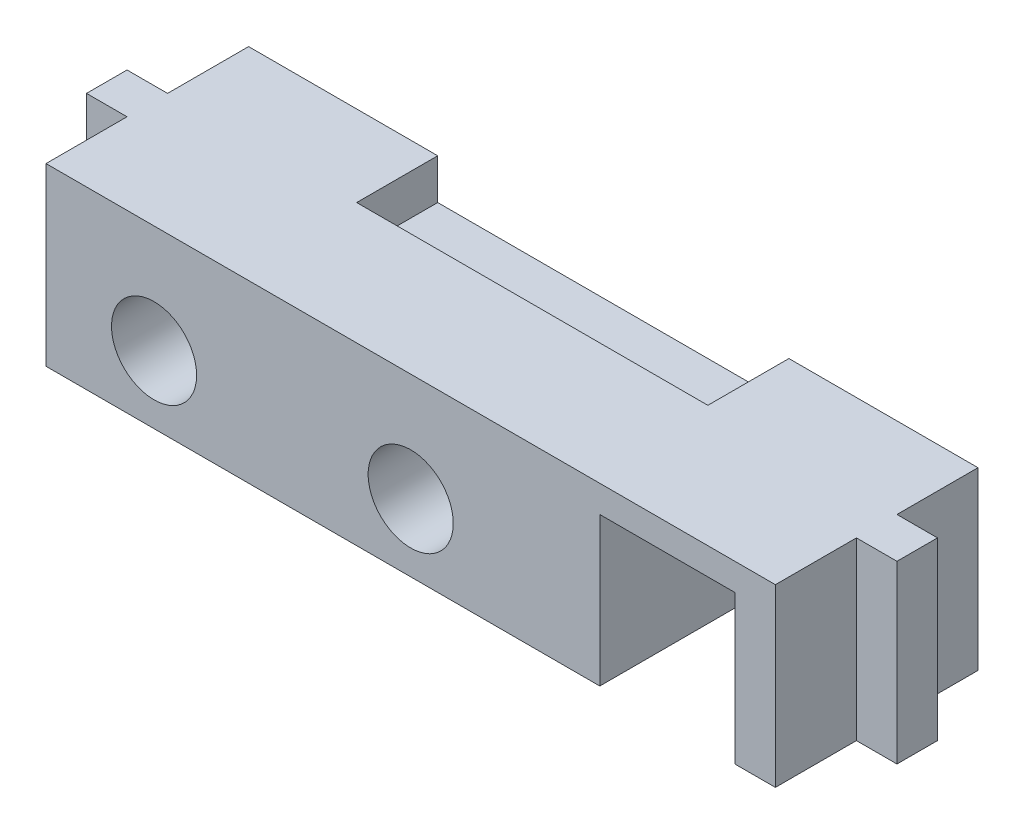
ISO-10303-21;
HEADER;
FILE_DESCRIPTION(('STEP AP214'),'2;1');
FILE_NAME('part.step','',(''),(''),'','','');
FILE_SCHEMA(('AUTOMOTIVE_DESIGN { 1 0 10303 214 1 1 1 1 }'));
ENDSEC;
DATA;
#1=APPLICATION_CONTEXT('core data for automotive mechanical design processes');
#2=APPLICATION_PROTOCOL_DEFINITION('international standard','automotive_design',2000,#1);
#3=PRODUCT_CONTEXT('',#1,'mechanical');
#4=PRODUCT('Part','Part','',(#3));
#5=PRODUCT_RELATED_PRODUCT_CATEGORY('part','',(#4));
#6=PRODUCT_DEFINITION_FORMATION('','',#4);
#7=PRODUCT_DEFINITION_CONTEXT('part definition',#1,'design');
#8=PRODUCT_DEFINITION('design','',#6,#7);
#9=PRODUCT_DEFINITION_SHAPE('','',#8);
#10=(LENGTH_UNIT() NAMED_UNIT(*) SI_UNIT(.MILLI.,.METRE.));
#11=(NAMED_UNIT(*) PLANE_ANGLE_UNIT() SI_UNIT($,.RADIAN.));
#12=(NAMED_UNIT(*) SI_UNIT($,.STERADIAN.) SOLID_ANGLE_UNIT());
#13=UNCERTAINTY_MEASURE_WITH_UNIT(LENGTH_MEASURE(1.E-05),#10,'distance_accuracy_value','');
#14=(GEOMETRIC_REPRESENTATION_CONTEXT(3) GLOBAL_UNCERTAINTY_ASSIGNED_CONTEXT((#13)) GLOBAL_UNIT_ASSIGNED_CONTEXT((#10,
#11,#12)) REPRESENTATION_CONTEXT('',''));
#15=CARTESIAN_POINT('',(0.,0.,0.));
#16=DIRECTION('',(0.,0.,1.));
#17=DIRECTION('',(1.,0.,0.));
#18=AXIS2_PLACEMENT_3D('',#15,#16,#17);
#19=CARTESIAN_POINT('',(0.,6.,7.5));
#20=DIRECTION('',(0.,-1.,0.));
#21=DIRECTION('',(1.,0.,0.));
#22=AXIS2_PLACEMENT_3D('',#19,#20,#21);
#23=PLANE('',#22);
#24=DIRECTION('',(-1.,0.,0.));
#25=VECTOR('',#24,1.);
#26=CARTESIAN_POINT('',(0.,6.,-7.5));
#27=LINE('',#26,#25);
#28=CARTESIAN_POINT('',(20.1000000000001,6.,-7.5));
#29=VERTEX_POINT('',#28);
#30=CARTESIAN_POINT('',(17.8999999999999,6.,-7.5));
#31=VERTEX_POINT('',#30);
#32=EDGE_CURVE('E272',#29,#31,#27,.T.);
#33=ORIENTED_EDGE('',*,*,#32,.F.);
#34=DIRECTION('',(0.,0.,-1.));
#35=VECTOR('',#34,1.);
#36=CARTESIAN_POINT('',(20.1000000000001,6.,-1.6));
#37=LINE('',#36,#35);
#38=CARTESIAN_POINT('',(20.1000000000001,6.,-1.6));
#39=VERTEX_POINT('',#38);
#40=EDGE_CURVE('E263',#39,#29,#37,.T.);
#41=ORIENTED_EDGE('',*,*,#40,.F.);
#42=DIRECTION('',(-1.,0.,0.));
#43=VECTOR('',#42,1.);
#44=CARTESIAN_POINT('',(0.,6.,-1.6));
#45=LINE('',#44,#43);
#46=CARTESIAN_POINT('',(24.,6.,-1.6));
#47=VERTEX_POINT('',#46);
#48=EDGE_CURVE('E249',#47,#39,#45,.T.);
#49=ORIENTED_EDGE('',*,*,#48,.F.);
#50=DIRECTION('',(0.,0.,-1.));
#51=VECTOR('',#50,1.);
#52=CARTESIAN_POINT('',(24.,6.,7.5));
#53=LINE('',#52,#51);
#54=CARTESIAN_POINT('',(24.,6.,7.5));
#55=VERTEX_POINT('',#54);
#56=EDGE_CURVE('E557',#55,#47,#53,.T.);
#57=ORIENTED_EDGE('',*,*,#56,.F.);
#58=DIRECTION('',(-1.,0.,0.));
#59=VECTOR('',#58,1.);
#60=CARTESIAN_POINT('',(0.,6.,7.5));
#61=LINE('',#60,#59);
#62=CARTESIAN_POINT('',(14.,6.,7.5));
#63=VERTEX_POINT('',#62);
#64=EDGE_CURVE('E553',#55,#63,#61,.T.);
#65=ORIENTED_EDGE('',*,*,#64,.T.);
#66=DIRECTION('',(0.,0.,-1.));
#67=VECTOR('',#66,1.);
#68=CARTESIAN_POINT('',(14.,6.,7.5));
#69=LINE('',#68,#67);
#70=CARTESIAN_POINT('',(14.,6.,-1.6));
#71=VERTEX_POINT('',#70);
#72=EDGE_CURVE('E589',#63,#71,#69,.T.);
#73=ORIENTED_EDGE('',*,*,#72,.T.);
#74=DIRECTION('',(-1.,0.,0.));
#75=VECTOR('',#74,1.);
#76=CARTESIAN_POINT('',(0.,6.,-1.6));
#77=LINE('',#76,#75);
#78=CARTESIAN_POINT('',(17.8999999999999,6.,-1.6));
#79=VERTEX_POINT('',#78);
#80=EDGE_CURVE('E288',#79,#71,#77,.T.);
#81=ORIENTED_EDGE('',*,*,#80,.F.);
#82=DIRECTION('',(0.,0.,-1.));
#83=VECTOR('',#82,1.);
#84=CARTESIAN_POINT('',(17.8999999999999,6.,-1.6));
#85=LINE('',#84,#83);
#86=EDGE_CURVE('E295',#79,#31,#85,.T.);
#87=ORIENTED_EDGE('',*,*,#86,.T.);
#88=EDGE_LOOP('',(#33,#41,#49,#57,#65,#73,#81,#87));
#89=FACE_BOUND('',#88,.T.);
#90=ADVANCED_FACE('F41',(#89),#23,.T.);
#91=CARTESIAN_POINT('',(24.,0.,7.5));
#92=DIRECTION('',(-1.,0.,0.));
#93=DIRECTION('',(0.,0.,1.));
#94=AXIS2_PLACEMENT_3D('',#91,#92,#93);
#95=PLANE('',#94);
#96=DIRECTION('',(0.,1.,0.));
#97=VECTOR('',#96,1.);
#98=CARTESIAN_POINT('',(24.,0.,-1.6));
#99=LINE('',#98,#97);
#100=CARTESIAN_POINT('',(24.,3.49428104193127,-1.6));
#101=VERTEX_POINT('',#100);
#102=EDGE_CURVE('E255',#101,#47,#99,.T.);
#103=ORIENTED_EDGE('',*,*,#102,.F.);
#104=DIRECTION('',(0.,0.,-1.));
#105=VECTOR('',#104,1.);
#106=CARTESIAN_POINT('',(24.,3.49428104193127,-1.6));
#107=LINE('',#106,#105);
#108=CARTESIAN_POINT('',(24.,3.49428104193127,-7.5));
#109=VERTEX_POINT('',#108);
#110=EDGE_CURVE('E266',#101,#109,#107,.T.);
#111=ORIENTED_EDGE('',*,*,#110,.T.);
#112=DIRECTION('',(0.,1.,0.));
#113=VECTOR('',#112,1.);
#114=CARTESIAN_POINT('',(24.,0.,-7.5));
#115=LINE('',#114,#113);
#116=CARTESIAN_POINT('',(24.,-5.,-7.5));
#117=VERTEX_POINT('',#116);
#118=EDGE_CURVE('E565',#117,#109,#115,.T.);
#119=ORIENTED_EDGE('',*,*,#118,.F.);
#120=DIRECTION('',(0.,0.,-1.));
#121=VECTOR('',#120,1.);
#122=CARTESIAN_POINT('',(24.,-5.,7.5));
#123=LINE('',#122,#121);
#124=CARTESIAN_POINT('',(24.,-5.,7.5));
#125=VERTEX_POINT('',#124);
#126=EDGE_CURVE('E11',#125,#117,#123,.T.);
#127=ORIENTED_EDGE('',*,*,#126,.F.);
#128=DIRECTION('',(0.,1.,0.));
#129=VECTOR('',#128,1.);
#130=CARTESIAN_POINT('',(24.,0.,7.5));
#131=LINE('',#130,#129);
#132=EDGE_CURVE('E535',#125,#55,#131,.T.);
#133=ORIENTED_EDGE('',*,*,#132,.T.);
#134=ORIENTED_EDGE('',*,*,#56,.T.);
#135=EDGE_LOOP('',(#103,#111,#119,#127,#133,#134));
#136=FACE_BOUND('',#135,.T.);
#137=ADVANCED_FACE('F650',(#136),#95,.T.);
#138=CARTESIAN_POINT('',(14.,0.,7.5));
#139=DIRECTION('',(-1.,0.,0.));
#140=DIRECTION('',(0.,-1.,0.));
#141=AXIS2_PLACEMENT_3D('',#138,#139,#140);
#142=PLANE('',#141);
#143=DIRECTION('',(0.,0.,-1.));
#144=VECTOR('',#143,1.);
#145=CARTESIAN_POINT('',(14.,3.49428104193123,-1.6));
#146=LINE('',#145,#144);
#147=CARTESIAN_POINT('',(14.,3.49428104193123,-1.6));
#148=VERTEX_POINT('',#147);
#149=CARTESIAN_POINT('',(14.,3.49428104193123,-7.5));
#150=VERTEX_POINT('',#149);
#151=EDGE_CURVE('E291',#148,#150,#146,.T.);
#152=ORIENTED_EDGE('',*,*,#151,.F.);
#153=DIRECTION('',(0.,-1.,0.));
#154=VECTOR('',#153,1.);
#155=CARTESIAN_POINT('',(14.,0.,-1.6));
#156=LINE('',#155,#154);
#157=EDGE_CURVE('E285',#71,#148,#156,.T.);
#158=ORIENTED_EDGE('',*,*,#157,.F.);
#159=ORIENTED_EDGE('',*,*,#72,.F.);
#160=DIRECTION('',(0.,1.,0.));
#161=VECTOR('',#160,1.);
#162=CARTESIAN_POINT('',(14.,0.,7.5));
#163=LINE('',#162,#161);
#164=CARTESIAN_POINT('',(14.,-5.,7.5));
#165=VERTEX_POINT('',#164);
#166=EDGE_CURVE('E550',#165,#63,#163,.T.);
#167=ORIENTED_EDGE('',*,*,#166,.F.);
#168=DIRECTION('',(0.,0.,-1.));
#169=VECTOR('',#168,1.);
#170=CARTESIAN_POINT('',(14.,-5.,7.5));
#171=LINE('',#170,#169);
#172=CARTESIAN_POINT('',(14.,-5.,-7.5));
#173=VERTEX_POINT('',#172);
#174=EDGE_CURVE('E593',#165,#173,#171,.T.);
#175=ORIENTED_EDGE('',*,*,#174,.T.);
#176=DIRECTION('',(0.,1.,0.));
#177=VECTOR('',#176,1.);
#178=CARTESIAN_POINT('',(14.,0.,-7.5));
#179=LINE('',#178,#177);
#180=EDGE_CURVE('E581',#173,#150,#179,.T.);
#181=ORIENTED_EDGE('',*,*,#180,.T.);
#182=EDGE_LOOP('',(#152,#158,#159,#167,#175,#181));
#183=FACE_BOUND('',#182,.T.);
#184=ADVANCED_FACE('F665',(#183),#142,.F.);
#185=CARTESIAN_POINT('',(30.,0.,7.5));
#186=DIRECTION('',(-1.,0.,0.));
#187=DIRECTION('',(0.,0.,1.));
#188=AXIS2_PLACEMENT_3D('',#185,#186,#187);
#189=PLANE('',#188);
#190=DIRECTION('',(0.,1.,0.));
#191=VECTOR('',#190,1.);
#192=CARTESIAN_POINT('',(30.,-5.,1.5));
#193=LINE('',#192,#191);
#194=CARTESIAN_POINT('',(30.,-5.,1.5));
#195=VERTEX_POINT('',#194);
#196=CARTESIAN_POINT('',(30.,8.,1.5));
#197=VERTEX_POINT('',#196);
#198=EDGE_CURVE('E338',#195,#197,#193,.T.);
#199=ORIENTED_EDGE('',*,*,#198,.F.);
#200=DIRECTION('',(0.,0.,-1.));
#201=VECTOR('',#200,1.);
#202=CARTESIAN_POINT('',(30.,-5.,7.5));
#203=LINE('',#202,#201);
#204=CARTESIAN_POINT('',(30.,-5.,-1.5));
#205=VERTEX_POINT('',#204);
#206=EDGE_CURVE('E50',#195,#205,#203,.T.);
#207=ORIENTED_EDGE('',*,*,#206,.T.);
#208=DIRECTION('',(0.,1.,0.));
#209=VECTOR('',#208,1.);
#210=CARTESIAN_POINT('',(30.,0.,-1.5));
#211=LINE('',#210,#209);
#212=CARTESIAN_POINT('',(30.,8.,-1.5));
#213=VERTEX_POINT('',#212);
#214=EDGE_CURVE('E413',#205,#213,#211,.T.);
#215=ORIENTED_EDGE('',*,*,#214,.T.);
#216=DIRECTION('',(0.,0.,-1.));
#217=VECTOR('',#216,1.);
#218=CARTESIAN_POINT('',(30.,8.,7.5));
#219=LINE('',#218,#217);
#220=EDGE_CURVE('E603',#197,#213,#219,.T.);
#221=ORIENTED_EDGE('',*,*,#220,.F.);
#222=EDGE_LOOP('',(#199,#207,#215,#221));
#223=FACE_BOUND('',#222,.T.);
#224=ADVANCED_FACE('F610',(#223),#189,.F.);
#225=CARTESIAN_POINT('',(0.,-5.,7.5));
#226=DIRECTION('',(0.,1.,0.));
#227=DIRECTION('',(0.,0.,1.));
#228=AXIS2_PLACEMENT_3D('',#225,#226,#227);
#229=PLANE('',#228);
#230=DIRECTION('',(0.,0.,-1.));
#231=VECTOR('',#230,1.);
#232=CARTESIAN_POINT('',(-10.,-5.,2.));
#233=LINE('',#232,#231);
#234=CARTESIAN_POINT('',(-10.,-5.,2.));
#235=VERTEX_POINT('',#234);
#236=CARTESIAN_POINT('',(-10.,-5.,-2.));
#237=VERTEX_POINT('',#236);
#238=EDGE_CURVE('E412',#235,#237,#233,.T.);
#239=ORIENTED_EDGE('',*,*,#238,.F.);
#240=DIRECTION('',(-1.,0.,0.));
#241=VECTOR('',#240,1.);
#242=CARTESIAN_POINT('',(-10.,-5.,2.));
#243=LINE('',#242,#241);
#244=CARTESIAN_POINT('',(-6.,-5.,2.));
#245=VERTEX_POINT('',#244);
#246=EDGE_CURVE('E442',#245,#235,#243,.T.);
#247=ORIENTED_EDGE('',*,*,#246,.F.);
#248=DIRECTION('',(0.,0.,1.));
#249=VECTOR('',#248,1.);
#250=CARTESIAN_POINT('',(-6.,-5.,2.));
#251=LINE('',#250,#249);
#252=CARTESIAN_POINT('',(-6.,-5.,-2.));
#253=VERTEX_POINT('',#252);
#254=EDGE_CURVE('E459',#253,#245,#251,.T.);
#255=ORIENTED_EDGE('',*,*,#254,.F.);
#256=DIRECTION('',(1.,0.,0.));
#257=VECTOR('',#256,1.);
#258=CARTESIAN_POINT('',(-10.,-5.,-2.));
#259=LINE('',#258,#257);
#260=EDGE_CURVE('E455',#237,#253,#259,.T.);
#261=ORIENTED_EDGE('',*,*,#260,.F.);
#262=EDGE_LOOP('',(#239,#247,#255,#261));
#263=FACE_BOUND('',#262,.T.);
#264=DIRECTION('',(0.,0.,-1.));
#265=VECTOR('',#264,1.);
#266=CARTESIAN_POINT('',(6.,-5.,2.));
#267=LINE('',#266,#265);
#268=CARTESIAN_POINT('',(6.,-5.,2.));
#269=VERTEX_POINT('',#268);
#270=CARTESIAN_POINT('',(6.,-5.,-2.));
#271=VERTEX_POINT('',#270);
#272=EDGE_CURVE('E481',#269,#271,#267,.T.);
#273=ORIENTED_EDGE('',*,*,#272,.F.);
#274=DIRECTION('',(-1.,0.,0.));
#275=VECTOR('',#274,1.);
#276=CARTESIAN_POINT('',(10.,-5.,2.));
#277=LINE('',#276,#275);
#278=CARTESIAN_POINT('',(10.,-5.,2.));
#279=VERTEX_POINT('',#278);
#280=EDGE_CURVE('E487',#279,#269,#277,.T.);
#281=ORIENTED_EDGE('',*,*,#280,.F.);
#282=DIRECTION('',(0.,0.,1.));
#283=VECTOR('',#282,1.);
#284=CARTESIAN_POINT('',(10.,-5.,2.));
#285=LINE('',#284,#283);
#286=CARTESIAN_POINT('',(10.,-5.,-2.));
#287=VERTEX_POINT('',#286);
#288=EDGE_CURVE('E504',#287,#279,#285,.T.);
#289=ORIENTED_EDGE('',*,*,#288,.F.);
#290=DIRECTION('',(1.,0.,0.));
#291=VECTOR('',#290,1.);
#292=CARTESIAN_POINT('',(10.,-5.,-2.));
#293=LINE('',#292,#291);
#294=EDGE_CURVE('E500',#271,#287,#293,.T.);
#295=ORIENTED_EDGE('',*,*,#294,.F.);
#296=EDGE_LOOP('',(#273,#281,#289,#295));
#297=FACE_BOUND('',#296,.T.);
#298=DIRECTION('',(1.,0.,0.));
#299=VECTOR('',#298,1.);
#300=CARTESIAN_POINT('',(0.,-5.,7.5));
#301=LINE('',#300,#299);
#302=CARTESIAN_POINT('',(-27.,-5.,7.5));
#303=VERTEX_POINT('',#302);
#304=EDGE_CURVE('E547',#303,#165,#301,.T.);
#305=ORIENTED_EDGE('',*,*,#304,.F.);
#306=DIRECTION('',(0.,0.,1.));
#307=VECTOR('',#306,1.);
#308=CARTESIAN_POINT('',(-27.,-5.,1.5));
#309=LINE('',#308,#307);
#310=CARTESIAN_POINT('',(-27.,-5.,1.5));
#311=VERTEX_POINT('',#310);
#312=EDGE_CURVE('E65',#311,#303,#309,.T.);
#313=ORIENTED_EDGE('',*,*,#312,.F.);
#314=DIRECTION('',(1.,0.,0.));
#315=VECTOR('',#314,1.);
#316=CARTESIAN_POINT('',(-27.,-5.,1.5));
#317=LINE('',#316,#315);
#318=CARTESIAN_POINT('',(-30.,-5.,1.5));
#319=VERTEX_POINT('',#318);
#320=EDGE_CURVE('E364',#319,#311,#317,.T.);
#321=ORIENTED_EDGE('',*,*,#320,.F.);
#322=DIRECTION('',(0.,0.,-1.));
#323=VECTOR('',#322,1.);
#324=CARTESIAN_POINT('',(-30.,-5.,7.5));
#325=LINE('',#324,#323);
#326=CARTESIAN_POINT('',(-30.,-5.,-1.5));
#327=VERTEX_POINT('',#326);
#328=EDGE_CURVE('E597',#319,#327,#325,.T.);
#329=ORIENTED_EDGE('',*,*,#328,.T.);
#330=DIRECTION('',(1.,0.,0.));
#331=VECTOR('',#330,1.);
#332=CARTESIAN_POINT('',(0.,-5.,-1.5));
#333=LINE('',#332,#331);
#334=CARTESIAN_POINT('',(-27.,-5.,-1.5));
#335=VERTEX_POINT('',#334);
#336=EDGE_CURVE('E389',#327,#335,#333,.T.);
#337=ORIENTED_EDGE('',*,*,#336,.T.);
#338=DIRECTION('',(0.,0.,-1.));
#339=VECTOR('',#338,1.);
#340=CARTESIAN_POINT('',(-27.,-5.,-1.5));
#341=LINE('',#340,#339);
#342=CARTESIAN_POINT('',(-27.,-5.,-7.5));
#343=VERTEX_POINT('',#342);
#344=EDGE_CURVE('E408',#335,#343,#341,.T.);
#345=ORIENTED_EDGE('',*,*,#344,.T.);
#346=DIRECTION('',(1.,0.,0.));
#347=VECTOR('',#346,1.);
#348=CARTESIAN_POINT('',(0.,-5.,-7.5));
#349=LINE('',#348,#347);
#350=EDGE_CURVE('E578',#343,#173,#349,.T.);
#351=ORIENTED_EDGE('',*,*,#350,.T.);
#352=ORIENTED_EDGE('',*,*,#174,.F.);
#353=EDGE_LOOP('',(#305,#313,#321,#329,#337,#345,#351,#352));
#354=FACE_BOUND('',#353,.T.);
#355=ADVANCED_FACE('F672',(#263,#297,#354),#229,.F.);
#356=CARTESIAN_POINT('',(0.,-5.,7.5));
#357=DIRECTION('',(0.,1.,0.));
#358=DIRECTION('',(0.,0.,1.));
#359=AXIS2_PLACEMENT_3D('',#356,#357,#358);
#360=PLANE('',#359);
#361=DIRECTION('',(1.,0.,0.));
#362=VECTOR('',#361,1.);
#363=CARTESIAN_POINT('',(27.,-5.,1.5));
#364=LINE('',#363,#362);
#365=CARTESIAN_POINT('',(27.,-5.,1.5));
#366=VERTEX_POINT('',#365);
#367=EDGE_CURVE('E350',#366,#195,#364,.T.);
#368=ORIENTED_EDGE('',*,*,#367,.F.);
#369=DIRECTION('',(0.,0.,1.));
#370=VECTOR('',#369,1.);
#371=CARTESIAN_POINT('',(27.,-5.,1.5));
#372=LINE('',#371,#370);
#373=CARTESIAN_POINT('',(27.,-5.,7.5));
#374=VERTEX_POINT('',#373);
#375=EDGE_CURVE('E357',#366,#374,#372,.T.);
#376=ORIENTED_EDGE('',*,*,#375,.T.);
#377=DIRECTION('',(1.,0.,0.));
#378=VECTOR('',#377,1.);
#379=CARTESIAN_POINT('',(0.,-5.,7.5));
#380=LINE('',#379,#378);
#381=EDGE_CURVE('E539',#125,#374,#380,.T.);
#382=ORIENTED_EDGE('',*,*,#381,.F.);
#383=ORIENTED_EDGE('',*,*,#126,.T.);
#384=DIRECTION('',(1.,0.,0.));
#385=VECTOR('',#384,1.);
#386=CARTESIAN_POINT('',(0.,-5.,-7.5));
#387=LINE('',#386,#385);
#388=CARTESIAN_POINT('',(27.,-5.,-7.5));
#389=VERTEX_POINT('',#388);
#390=EDGE_CURVE('E569',#117,#389,#387,.T.);
#391=ORIENTED_EDGE('',*,*,#390,.T.);
#392=DIRECTION('',(0.,0.,-1.));
#393=VECTOR('',#392,1.);
#394=CARTESIAN_POINT('',(27.,-5.,-1.5));
#395=LINE('',#394,#393);
#396=CARTESIAN_POINT('',(27.,-5.,-1.5));
#397=VERTEX_POINT('',#396);
#398=EDGE_CURVE('E428',#397,#389,#395,.T.);
#399=ORIENTED_EDGE('',*,*,#398,.F.);
#400=DIRECTION('',(1.,0.,0.));
#401=VECTOR('',#400,1.);
#402=CARTESIAN_POINT('',(0.,-5.,-1.5));
#403=LINE('',#402,#401);
#404=EDGE_CURVE('E424',#397,#205,#403,.T.);
#405=ORIENTED_EDGE('',*,*,#404,.T.);
#406=ORIENTED_EDGE('',*,*,#206,.F.);
#407=EDGE_LOOP('',(#368,#376,#382,#383,#391,#399,#405,#406));
#408=FACE_BOUND('',#407,.T.);
#409=ADVANCED_FACE('F620',(#408),#360,.F.);
#410=CARTESIAN_POINT('',(0.,8.,7.5));
#411=DIRECTION('',(0.,1.,0.));
#412=DIRECTION('',(0.,0.,1.));
#413=AXIS2_PLACEMENT_3D('',#410,#411,#412);
#414=PLANE('',#413);
#415=DIRECTION('',(0.,0.,-1.));
#416=VECTOR('',#415,1.);
#417=CARTESIAN_POINT('',(13.,8.00000000000001,-1.5));
#418=LINE('',#417,#416);
#419=CARTESIAN_POINT('',(13.,8.00000000000001,-1.5));
#420=VERTEX_POINT('',#419);
#421=CARTESIAN_POINT('',(13.,8.00000000000001,-7.5));
#422=VERTEX_POINT('',#421);
#423=EDGE_CURVE('E329',#420,#422,#418,.T.);
#424=ORIENTED_EDGE('',*,*,#423,.F.);
#425=DIRECTION('',(1.,0.,0.));
#426=VECTOR('',#425,1.);
#427=CARTESIAN_POINT('',(13.,8.00000000000001,-1.5));
#428=LINE('',#427,#426);
#429=CARTESIAN_POINT('',(-13.,8.00000000000001,-1.5));
#430=VERTEX_POINT('',#429);
#431=EDGE_CURVE('E309',#430,#420,#428,.T.);
#432=ORIENTED_EDGE('',*,*,#431,.F.);
#433=DIRECTION('',(0.,0.,-1.));
#434=VECTOR('',#433,1.);
#435=CARTESIAN_POINT('',(-13.,8.00000000000001,-1.5));
#436=LINE('',#435,#434);
#437=CARTESIAN_POINT('',(-13.,8.00000000000001,-7.5));
#438=VERTEX_POINT('',#437);
#439=EDGE_CURVE('E332',#430,#438,#436,.T.);
#440=ORIENTED_EDGE('',*,*,#439,.T.);
#441=DIRECTION('',(1.,0.,0.));
#442=VECTOR('',#441,1.);
#443=CARTESIAN_POINT('',(0.,8.,-7.5));
#444=LINE('',#443,#442);
#445=CARTESIAN_POINT('',(-27.,8.,-7.5));
#446=VERTEX_POINT('',#445);
#447=EDGE_CURVE('E574',#446,#438,#444,.T.);
#448=ORIENTED_EDGE('',*,*,#447,.F.);
#449=DIRECTION('',(0.,0.,-1.));
#450=VECTOR('',#449,1.);
#451=CARTESIAN_POINT('',(-27.,8.,-1.5));
#452=LINE('',#451,#450);
#453=CARTESIAN_POINT('',(-27.,8.,-1.5));
#454=VERTEX_POINT('',#453);
#455=EDGE_CURVE('E401',#454,#446,#452,.T.);
#456=ORIENTED_EDGE('',*,*,#455,.F.);
#457=DIRECTION('',(-1.,0.,0.));
#458=VECTOR('',#457,1.);
#459=CARTESIAN_POINT('',(0.,8.,-1.5));
#460=LINE('',#459,#458);
#461=CARTESIAN_POINT('',(-30.,8.,-1.5));
#462=VERTEX_POINT('',#461);
#463=EDGE_CURVE('E397',#454,#462,#460,.T.);
#464=ORIENTED_EDGE('',*,*,#463,.T.);
#465=DIRECTION('',(0.,0.,-1.));
#466=VECTOR('',#465,1.);
#467=CARTESIAN_POINT('',(-30.,8.,7.5));
#468=LINE('',#467,#466);
#469=CARTESIAN_POINT('',(-30.,8.,1.5));
#470=VERTEX_POINT('',#469);
#471=EDGE_CURVE('E600',#470,#462,#468,.T.);
#472=ORIENTED_EDGE('',*,*,#471,.F.);
#473=DIRECTION('',(-1.,0.,0.));
#474=VECTOR('',#473,1.);
#475=CARTESIAN_POINT('',(-30.,8.,1.5));
#476=LINE('',#475,#474);
#477=CARTESIAN_POINT('',(-27.,8.,1.5));
#478=VERTEX_POINT('',#477);
#479=EDGE_CURVE('E372',#478,#470,#476,.T.);
#480=ORIENTED_EDGE('',*,*,#479,.F.);
#481=DIRECTION('',(0.,0.,1.));
#482=VECTOR('',#481,1.);
#483=CARTESIAN_POINT('',(-27.,8.,1.5));
#484=LINE('',#483,#482);
#485=CARTESIAN_POINT('',(-27.,8.,7.5));
#486=VERTEX_POINT('',#485);
#487=EDGE_CURVE('E356',#478,#486,#484,.T.);
#488=ORIENTED_EDGE('',*,*,#487,.T.);
#489=DIRECTION('',(1.,0.,0.));
#490=VECTOR('',#489,1.);
#491=CARTESIAN_POINT('',(0.,8.,7.5));
#492=LINE('',#491,#490);
#493=CARTESIAN_POINT('',(27.,8.,7.5));
#494=VERTEX_POINT('',#493);
#495=EDGE_CURVE('E543',#486,#494,#492,.T.);
#496=ORIENTED_EDGE('',*,*,#495,.T.);
#497=DIRECTION('',(0.,0.,1.));
#498=VECTOR('',#497,1.);
#499=CARTESIAN_POINT('',(27.,8.,1.5));
#500=LINE('',#499,#498);
#501=CARTESIAN_POINT('',(27.,8.,1.5));
#502=VERTEX_POINT('',#501);
#503=EDGE_CURVE('E353',#502,#494,#500,.T.);
#504=ORIENTED_EDGE('',*,*,#503,.F.);
#505=DIRECTION('',(-1.,0.,0.));
#506=VECTOR('',#505,1.);
#507=CARTESIAN_POINT('',(30.,8.,1.5));
#508=LINE('',#507,#506);
#509=EDGE_CURVE('E341',#197,#502,#508,.T.);
#510=ORIENTED_EDGE('',*,*,#509,.F.);
#511=ORIENTED_EDGE('',*,*,#220,.T.);
#512=DIRECTION('',(-1.,0.,0.));
#513=VECTOR('',#512,1.);
#514=CARTESIAN_POINT('',(0.,8.,-1.5));
#515=LINE('',#514,#513);
#516=CARTESIAN_POINT('',(27.,8.,-1.5));
#517=VERTEX_POINT('',#516);
#518=EDGE_CURVE('E417',#213,#517,#515,.T.);
#519=ORIENTED_EDGE('',*,*,#518,.T.);
#520=DIRECTION('',(0.,0.,-1.));
#521=VECTOR('',#520,1.);
#522=CARTESIAN_POINT('',(27.,8.,-1.5));
#523=LINE('',#522,#521);
#524=CARTESIAN_POINT('',(27.,8.,-7.5));
#525=VERTEX_POINT('',#524);
#526=EDGE_CURVE('E405',#517,#525,#523,.T.);
#527=ORIENTED_EDGE('',*,*,#526,.T.);
#528=EDGE_CURVE('E573',#422,#525,#444,.T.);
#529=ORIENTED_EDGE('',*,*,#528,.F.);
#530=EDGE_LOOP('',(#424,#432,#440,#448,#456,#464,#472,#480,#488,#496,#504,#510,#511,#519,#527,#529));
#531=FACE_BOUND('',#530,.T.);
#532=ADVANCED_FACE('F634',(#531),#414,.T.);
#533=CARTESIAN_POINT('',(0.,0.,-7.5));
#534=DIRECTION('',(0.,0.,1.));
#535=DIRECTION('',(1.,0.,0.));
#536=AXIS2_PLACEMENT_3D('',#533,#534,#535);
#537=PLANE('',#536);
#538=CARTESIAN_POINT('',(19.,0.,-7.5));
#539=DIRECTION('',(0.,0.,-1.));
#540=DIRECTION('',(-1.,0.,0.));
#541=AXIS2_PLACEMENT_3D('',#538,#539,#540);
#542=CIRCLE('',#541,6.1);
#543=EDGE_CURVE('E268',#29,#109,#542,.T.);
#544=ORIENTED_EDGE('',*,*,#543,.F.);
#545=ORIENTED_EDGE('',*,*,#32,.T.);
#546=CARTESIAN_POINT('',(19.,0.,-7.5));
#547=DIRECTION('',(0.,0.,-1.));
#548=DIRECTION('',(-1.,0.,0.));
#549=AXIS2_PLACEMENT_3D('',#546,#547,#548);
#550=CIRCLE('',#549,6.1);
#551=EDGE_CURVE('E277',#150,#31,#550,.T.);
#552=ORIENTED_EDGE('',*,*,#551,.F.);
#553=ORIENTED_EDGE('',*,*,#180,.F.);
#554=ORIENTED_EDGE('',*,*,#350,.F.);
#555=DIRECTION('',(0.,1.,0.));
#556=VECTOR('',#555,1.);
#557=CARTESIAN_POINT('',(-27.,0.,-7.5));
#558=LINE('',#557,#556);
#559=EDGE_CURVE('E390',#343,#446,#558,.T.);
#560=ORIENTED_EDGE('',*,*,#559,.T.);
#561=ORIENTED_EDGE('',*,*,#447,.T.);
#562=DIRECTION('',(0.,1.,0.));
#563=VECTOR('',#562,1.);
#564=CARTESIAN_POINT('',(-13.,5.00000000000001,-7.5));
#565=LINE('',#564,#563);
#566=CARTESIAN_POINT('',(-13.,5.00000000000001,-7.5));
#567=VERTEX_POINT('',#566);
#568=EDGE_CURVE('E319',#567,#438,#565,.T.);
#569=ORIENTED_EDGE('',*,*,#568,.F.);
#570=DIRECTION('',(-1.,0.,0.));
#571=VECTOR('',#570,1.);
#572=CARTESIAN_POINT('',(13.,5.00000000000001,-7.5));
#573=LINE('',#572,#571);
#574=CARTESIAN_POINT('',(13.,5.00000000000001,-7.5));
#575=VERTEX_POINT('',#574);
#576=EDGE_CURVE('E57',#575,#567,#573,.T.);
#577=ORIENTED_EDGE('',*,*,#576,.F.);
#578=DIRECTION('',(0.,-1.,0.));
#579=VECTOR('',#578,1.);
#580=CARTESIAN_POINT('',(13.,5.00000000000001,-7.5));
#581=LINE('',#580,#579);
#582=EDGE_CURVE('E305',#422,#575,#581,.T.);
#583=ORIENTED_EDGE('',*,*,#582,.F.);
#584=ORIENTED_EDGE('',*,*,#528,.T.);
#585=DIRECTION('',(0.,-1.,0.));
#586=VECTOR('',#585,1.);
#587=CARTESIAN_POINT('',(27.,0.,-7.5));
#588=LINE('',#587,#586);
#589=EDGE_CURVE('E361',#525,#389,#588,.T.);
#590=ORIENTED_EDGE('',*,*,#589,.T.);
#591=ORIENTED_EDGE('',*,*,#390,.F.);
#592=ORIENTED_EDGE('',*,*,#118,.T.);
#593=EDGE_LOOP('',(#544,#545,#552,#553,#554,#560,#561,#569,#577,#583,#584,#590,#591,#592));
#594=FACE_BOUND('',#593,.T.);
#595=CARTESIAN_POINT('',(0.,0.,-7.5));
#596=DIRECTION('',(0.,0.,1.));
#597=DIRECTION('',(1.,0.,0.));
#598=AXIS2_PLACEMENT_3D('',#595,#596,#597);
#599=CIRCLE('',#598,3.15);
#600=CARTESIAN_POINT('',(3.15,0.,-7.5));
#601=VERTEX_POINT('',#600);
#602=EDGE_CURVE('E526',#601,#601,#599,.T.);
#603=ORIENTED_EDGE('',*,*,#602,.T.);
#604=EDGE_LOOP('',(#603));
#605=FACE_BOUND('',#604,.T.);
#606=CARTESIAN_POINT('',(-19.,0.,-7.5));
#607=DIRECTION('',(0.,0.,1.));
#608=DIRECTION('',(1.,0.,0.));
#609=AXIS2_PLACEMENT_3D('',#606,#607,#608);
#610=CIRCLE('',#609,3.15);
#611=CARTESIAN_POINT('',(-15.85,0.,-7.5));
#612=VERTEX_POINT('',#611);
#613=EDGE_CURVE('E561',#612,#612,#610,.T.);
#614=ORIENTED_EDGE('',*,*,#613,.T.);
#615=EDGE_LOOP('',(#614));
#616=FACE_BOUND('',#615,.T.);
#617=ADVANCED_FACE('F626',(#594,#605,#616),#537,.F.);
#618=CARTESIAN_POINT('',(-30.,0.,7.5));
#619=DIRECTION('',(-1.,0.,0.));
#620=DIRECTION('',(0.,0.,1.));
#621=AXIS2_PLACEMENT_3D('',#618,#619,#620);
#622=PLANE('',#621);
#623=DIRECTION('',(0.,-1.,0.));
#624=VECTOR('',#623,1.);
#625=CARTESIAN_POINT('',(-30.,-5.,1.5));
#626=LINE('',#625,#624);
#627=EDGE_CURVE('E375',#470,#319,#626,.T.);
#628=ORIENTED_EDGE('',*,*,#627,.F.);
#629=ORIENTED_EDGE('',*,*,#471,.T.);
#630=DIRECTION('',(0.,-1.,0.));
#631=VECTOR('',#630,1.);
#632=CARTESIAN_POINT('',(-30.,0.,-1.5));
#633=LINE('',#632,#631);
#634=EDGE_CURVE('E385',#462,#327,#633,.T.);
#635=ORIENTED_EDGE('',*,*,#634,.T.);
#636=ORIENTED_EDGE('',*,*,#328,.F.);
#637=EDGE_LOOP('',(#628,#629,#635,#636));
#638=FACE_BOUND('',#637,.T.);
#639=ADVANCED_FACE('F717',(#638),#622,.T.);
#640=CARTESIAN_POINT('',(-19.,0.,7.5));
#641=DIRECTION('',(0.,0.,-1.));
#642=DIRECTION('',(-1.,0.,0.));
#643=AXIS2_PLACEMENT_3D('',#640,#641,#642);
#644=CYLINDRICAL_SURFACE('',#643,3.15);
#645=CARTESIAN_POINT('',(-19.,0.,7.5));
#646=DIRECTION('',(0.,0.,1.));
#647=DIRECTION('',(1.,0.,0.));
#648=AXIS2_PLACEMENT_3D('',#645,#646,#647);
#649=CIRCLE('',#648,3.15);
#650=CARTESIAN_POINT('',(-15.85,0.,7.5));
#651=VERTEX_POINT('',#650);
#652=EDGE_CURVE('E531',#651,#651,#649,.T.);
#653=ORIENTED_EDGE('',*,*,#652,.T.);
#654=EDGE_LOOP('',(#653));
#655=FACE_BOUND('',#654,.T.);
#656=ORIENTED_EDGE('',*,*,#613,.F.);
#657=EDGE_LOOP('',(#656));
#658=FACE_BOUND('',#657,.T.);
#659=ADVANCED_FACE('F720',(#655,#658),#644,.F.);
#660=CARTESIAN_POINT('',(0.,0.,7.5));
#661=DIRECTION('',(0.,0.,-1.));
#662=DIRECTION('',(-1.,0.,0.));
#663=AXIS2_PLACEMENT_3D('',#660,#661,#662);
#664=CYLINDRICAL_SURFACE('',#663,3.15);
#665=CARTESIAN_POINT('',(0.,0.,7.5));
#666=DIRECTION('',(0.,0.,1.));
#667=DIRECTION('',(1.,0.,0.));
#668=AXIS2_PLACEMENT_3D('',#665,#666,#667);
#669=CIRCLE('',#668,3.15);
#670=CARTESIAN_POINT('',(3.15,0.,7.5));
#671=VERTEX_POINT('',#670);
#672=EDGE_CURVE('E527',#671,#671,#669,.T.);
#673=ORIENTED_EDGE('',*,*,#672,.T.);
#674=EDGE_LOOP('',(#673));
#675=FACE_BOUND('',#674,.T.);
#676=ORIENTED_EDGE('',*,*,#602,.F.);
#677=EDGE_LOOP('',(#676));
#678=FACE_BOUND('',#677,.T.);
#679=ADVANCED_FACE('F43',(#675,#678),#664,.F.);
#680=CARTESIAN_POINT('',(0.,0.,7.5));
#681=DIRECTION('',(0.,0.,1.));
#682=DIRECTION('',(1.,0.,0.));
#683=AXIS2_PLACEMENT_3D('',#680,#681,#682);
#684=PLANE('',#683);
#685=DIRECTION('',(0.,-1.,0.));
#686=VECTOR('',#685,1.);
#687=CARTESIAN_POINT('',(27.,8.,7.5));
#688=LINE('',#687,#686);
#689=EDGE_CURVE('E342',#494,#374,#688,.T.);
#690=ORIENTED_EDGE('',*,*,#689,.F.);
#691=ORIENTED_EDGE('',*,*,#495,.F.);
#692=DIRECTION('',(0.,1.,0.));
#693=VECTOR('',#692,1.);
#694=CARTESIAN_POINT('',(-27.,8.,7.5));
#695=LINE('',#694,#693);
#696=EDGE_CURVE('E328',#303,#486,#695,.T.);
#697=ORIENTED_EDGE('',*,*,#696,.F.);
#698=ORIENTED_EDGE('',*,*,#304,.T.);
#699=ORIENTED_EDGE('',*,*,#166,.T.);
#700=ORIENTED_EDGE('',*,*,#64,.F.);
#701=ORIENTED_EDGE('',*,*,#132,.F.);
#702=ORIENTED_EDGE('',*,*,#381,.T.);
#703=EDGE_LOOP('',(#690,#691,#697,#698,#699,#700,#701,#702));
#704=FACE_BOUND('',#703,.T.);
#705=ORIENTED_EDGE('',*,*,#672,.F.);
#706=EDGE_LOOP('',(#705));
#707=FACE_BOUND('',#706,.T.);
#708=ORIENTED_EDGE('',*,*,#652,.F.);
#709=EDGE_LOOP('',(#708));
#710=FACE_BOUND('',#709,.T.);
#711=ADVANCED_FACE('F645',(#704,#707,#710),#684,.T.);
#712=CARTESIAN_POINT('',(6.,-7.5,2.));
#713=DIRECTION('',(1.,0.,0.));
#714=DIRECTION('',(0.,0.,-1.));
#715=AXIS2_PLACEMENT_3D('',#712,#713,#714);
#716=PLANE('',#715);
#717=ORIENTED_EDGE('',*,*,#272,.T.);
#718=DIRECTION('',(0.,1.,0.));
#719=VECTOR('',#718,1.);
#720=CARTESIAN_POINT('',(6.,-7.5,-2.));
#721=LINE('',#720,#719);
#722=CARTESIAN_POINT('',(6.,-7.5,-2.));
#723=VERTEX_POINT('',#722);
#724=EDGE_CURVE('E522',#723,#271,#721,.T.);
#725=ORIENTED_EDGE('',*,*,#724,.F.);
#726=DIRECTION('',(0.,0.,-1.));
#727=VECTOR('',#726,1.);
#728=CARTESIAN_POINT('',(6.,-7.5,2.));
#729=LINE('',#728,#727);
#730=CARTESIAN_POINT('',(6.,-7.5,2.));
#731=VERTEX_POINT('',#730);
#732=EDGE_CURVE('E482',#731,#723,#729,.T.);
#733=ORIENTED_EDGE('',*,*,#732,.F.);
#734=DIRECTION('',(0.,1.,0.));
#735=VECTOR('',#734,1.);
#736=CARTESIAN_POINT('',(6.,-7.5,2.));
#737=LINE('',#736,#735);
#738=EDGE_CURVE('E496',#731,#269,#737,.T.);
#739=ORIENTED_EDGE('',*,*,#738,.T.);
#740=EDGE_LOOP('',(#717,#725,#733,#739));
#741=FACE_BOUND('',#740,.T.);
#742=ADVANCED_FACE('F762',(#741),#716,.F.);
#743=CARTESIAN_POINT('',(10.,-7.5,-2.));
#744=DIRECTION('',(0.,0.,1.));
#745=DIRECTION('',(1.,0.,0.));
#746=AXIS2_PLACEMENT_3D('',#743,#744,#745);
#747=PLANE('',#746);
#748=ORIENTED_EDGE('',*,*,#294,.T.);
#749=DIRECTION('',(0.,1.,0.));
#750=VECTOR('',#749,1.);
#751=CARTESIAN_POINT('',(10.,-7.5,-2.));
#752=LINE('',#751,#750);
#753=CARTESIAN_POINT('',(10.,-7.5,-2.));
#754=VERTEX_POINT('',#753);
#755=EDGE_CURVE('E518',#754,#287,#752,.T.);
#756=ORIENTED_EDGE('',*,*,#755,.F.);
#757=DIRECTION('',(1.,0.,0.));
#758=VECTOR('',#757,1.);
#759=CARTESIAN_POINT('',(10.,-7.5,-2.));
#760=LINE('',#759,#758);
#761=EDGE_CURVE('E486',#723,#754,#760,.T.);
#762=ORIENTED_EDGE('',*,*,#761,.F.);
#763=ORIENTED_EDGE('',*,*,#724,.T.);
#764=EDGE_LOOP('',(#748,#756,#762,#763));
#765=FACE_BOUND('',#764,.T.);
#766=ADVANCED_FACE('F956',(#765),#747,.F.);
#767=CARTESIAN_POINT('',(10.,-7.5,2.));
#768=DIRECTION('',(-1.,0.,0.));
#769=DIRECTION('',(0.,0.,1.));
#770=AXIS2_PLACEMENT_3D('',#767,#768,#769);
#771=PLANE('',#770);
#772=ORIENTED_EDGE('',*,*,#288,.T.);
#773=DIRECTION('',(0.,1.,0.));
#774=VECTOR('',#773,1.);
#775=CARTESIAN_POINT('',(10.,-7.5,2.));
#776=LINE('',#775,#774);
#777=CARTESIAN_POINT('',(10.,-7.5,2.));
#778=VERTEX_POINT('',#777);
#779=EDGE_CURVE('E514',#778,#279,#776,.T.);
#780=ORIENTED_EDGE('',*,*,#779,.F.);
#781=DIRECTION('',(0.,0.,1.));
#782=VECTOR('',#781,1.);
#783=CARTESIAN_POINT('',(10.,-7.5,2.));
#784=LINE('',#783,#782);
#785=EDGE_CURVE('E490',#754,#778,#784,.T.);
#786=ORIENTED_EDGE('',*,*,#785,.F.);
#787=ORIENTED_EDGE('',*,*,#755,.T.);
#788=EDGE_LOOP('',(#772,#780,#786,#787));
#789=FACE_BOUND('',#788,.T.);
#790=ADVANCED_FACE('F948',(#789),#771,.F.);
#791=CARTESIAN_POINT('',(10.,-7.5,2.));
#792=DIRECTION('',(0.,0.,-1.));
#793=DIRECTION('',(-1.,0.,0.));
#794=AXIS2_PLACEMENT_3D('',#791,#792,#793);
#795=PLANE('',#794);
#796=ORIENTED_EDGE('',*,*,#280,.T.);
#797=ORIENTED_EDGE('',*,*,#738,.F.);
#798=DIRECTION('',(-1.,0.,0.));
#799=VECTOR('',#798,1.);
#800=CARTESIAN_POINT('',(10.,-7.5,2.));
#801=LINE('',#800,#799);
#802=EDGE_CURVE('E493',#778,#731,#801,.T.);
#803=ORIENTED_EDGE('',*,*,#802,.F.);
#804=ORIENTED_EDGE('',*,*,#779,.T.);
#805=EDGE_LOOP('',(#796,#797,#803,#804));
#806=FACE_BOUND('',#805,.T.);
#807=ADVANCED_FACE('F940',(#806),#795,.F.);
#808=CARTESIAN_POINT('',(0.,-7.5,0.));
#809=DIRECTION('',(0.,1.,0.));
#810=DIRECTION('',(0.,0.,1.));
#811=AXIS2_PLACEMENT_3D('',#808,#809,#810);
#812=PLANE('',#811);
#813=ORIENTED_EDGE('',*,*,#732,.T.);
#814=ORIENTED_EDGE('',*,*,#761,.T.);
#815=ORIENTED_EDGE('',*,*,#785,.T.);
#816=ORIENTED_EDGE('',*,*,#802,.T.);
#817=EDGE_LOOP('',(#813,#814,#815,#816));
#818=FACE_BOUND('',#817,.T.);
#819=ADVANCED_FACE('F932',(#818),#812,.F.);
#820=CARTESIAN_POINT('',(-10.,-7.5,2.));
#821=DIRECTION('',(1.,0.,0.));
#822=DIRECTION('',(0.,0.,-1.));
#823=AXIS2_PLACEMENT_3D('',#820,#821,#822);
#824=PLANE('',#823);
#825=ORIENTED_EDGE('',*,*,#238,.T.);
#826=DIRECTION('',(0.,1.,0.));
#827=VECTOR('',#826,1.);
#828=CARTESIAN_POINT('',(-10.,-7.5,-2.));
#829=LINE('',#828,#827);
#830=CARTESIAN_POINT('',(-10.,-7.5,-2.));
#831=VERTEX_POINT('',#830);
#832=EDGE_CURVE('E477',#831,#237,#829,.T.);
#833=ORIENTED_EDGE('',*,*,#832,.F.);
#834=DIRECTION('',(0.,0.,-1.));
#835=VECTOR('',#834,1.);
#836=CARTESIAN_POINT('',(-10.,-7.5,2.));
#837=LINE('',#836,#835);
#838=CARTESIAN_POINT('',(-10.,-7.5,2.));
#839=VERTEX_POINT('',#838);
#840=EDGE_CURVE('E437',#839,#831,#837,.T.);
#841=ORIENTED_EDGE('',*,*,#840,.F.);
#842=DIRECTION('',(0.,1.,0.));
#843=VECTOR('',#842,1.);
#844=CARTESIAN_POINT('',(-10.,-7.5,2.));
#845=LINE('',#844,#843);
#846=EDGE_CURVE('E451',#839,#235,#845,.T.);
#847=ORIENTED_EDGE('',*,*,#846,.T.);
#848=EDGE_LOOP('',(#825,#833,#841,#847));
#849=FACE_BOUND('',#848,.T.);
#850=ADVANCED_FACE('F924',(#849),#824,.F.);
#851=CARTESIAN_POINT('',(-10.,-7.5,-2.));
#852=DIRECTION('',(0.,0.,1.));
#853=DIRECTION('',(1.,0.,0.));
#854=AXIS2_PLACEMENT_3D('',#851,#852,#853);
#855=PLANE('',#854);
#856=ORIENTED_EDGE('',*,*,#260,.T.);
#857=DIRECTION('',(0.,1.,0.));
#858=VECTOR('',#857,1.);
#859=CARTESIAN_POINT('',(-6.,-7.5,-2.));
#860=LINE('',#859,#858);
#861=CARTESIAN_POINT('',(-6.,-7.5,-2.));
#862=VERTEX_POINT('',#861);
#863=EDGE_CURVE('E473',#862,#253,#860,.T.);
#864=ORIENTED_EDGE('',*,*,#863,.F.);
#865=DIRECTION('',(1.,0.,0.));
#866=VECTOR('',#865,1.);
#867=CARTESIAN_POINT('',(-10.,-7.5,-2.));
#868=LINE('',#867,#866);
#869=EDGE_CURVE('E441',#831,#862,#868,.T.);
#870=ORIENTED_EDGE('',*,*,#869,.F.);
#871=ORIENTED_EDGE('',*,*,#832,.T.);
#872=EDGE_LOOP('',(#856,#864,#870,#871));
#873=FACE_BOUND('',#872,.T.);
#874=ADVANCED_FACE('F916',(#873),#855,.F.);
#875=CARTESIAN_POINT('',(-6.,-7.5,2.));
#876=DIRECTION('',(-1.,0.,0.));
#877=DIRECTION('',(0.,0.,1.));
#878=AXIS2_PLACEMENT_3D('',#875,#876,#877);
#879=PLANE('',#878);
#880=ORIENTED_EDGE('',*,*,#254,.T.);
#881=DIRECTION('',(0.,1.,0.));
#882=VECTOR('',#881,1.);
#883=CARTESIAN_POINT('',(-6.,-7.5,2.));
#884=LINE('',#883,#882);
#885=CARTESIAN_POINT('',(-6.,-7.5,2.));
#886=VERTEX_POINT('',#885);
#887=EDGE_CURVE('E469',#886,#245,#884,.T.);
#888=ORIENTED_EDGE('',*,*,#887,.F.);
#889=DIRECTION('',(0.,0.,1.));
#890=VECTOR('',#889,1.);
#891=CARTESIAN_POINT('',(-6.,-7.5,2.));
#892=LINE('',#891,#890);
#893=EDGE_CURVE('E445',#862,#886,#892,.T.);
#894=ORIENTED_EDGE('',*,*,#893,.F.);
#895=ORIENTED_EDGE('',*,*,#863,.T.);
#896=EDGE_LOOP('',(#880,#888,#894,#895));
#897=FACE_BOUND('',#896,.T.);
#898=ADVANCED_FACE('F908',(#897),#879,.F.);
#899=CARTESIAN_POINT('',(-10.,-7.5,2.));
#900=DIRECTION('',(0.,0.,-1.));
#901=DIRECTION('',(-1.,0.,0.));
#902=AXIS2_PLACEMENT_3D('',#899,#900,#901);
#903=PLANE('',#902);
#904=ORIENTED_EDGE('',*,*,#246,.T.);
#905=ORIENTED_EDGE('',*,*,#846,.F.);
#906=DIRECTION('',(-1.,0.,0.));
#907=VECTOR('',#906,1.);
#908=CARTESIAN_POINT('',(-10.,-7.5,2.));
#909=LINE('',#908,#907);
#910=EDGE_CURVE('E448',#886,#839,#909,.T.);
#911=ORIENTED_EDGE('',*,*,#910,.F.);
#912=ORIENTED_EDGE('',*,*,#887,.T.);
#913=EDGE_LOOP('',(#904,#905,#911,#912));
#914=FACE_BOUND('',#913,.T.);
#915=ADVANCED_FACE('F900',(#914),#903,.F.);
#916=CARTESIAN_POINT('',(0.,-7.5,0.));
#917=DIRECTION('',(0.,-1.,0.));
#918=DIRECTION('',(0.,0.,-1.));
#919=AXIS2_PLACEMENT_3D('',#916,#917,#918);
#920=PLANE('',#919);
#921=ORIENTED_EDGE('',*,*,#840,.T.);
#922=ORIENTED_EDGE('',*,*,#869,.T.);
#923=ORIENTED_EDGE('',*,*,#893,.T.);
#924=ORIENTED_EDGE('',*,*,#910,.T.);
#925=EDGE_LOOP('',(#921,#922,#923,#924));
#926=FACE_BOUND('',#925,.T.);
#927=ADVANCED_FACE('F869',(#926),#920,.T.);
#928=CARTESIAN_POINT('',(27.,0.,-1.5));
#929=DIRECTION('',(1.,0.,0.));
#930=DIRECTION('',(0.,0.,-1.));
#931=AXIS2_PLACEMENT_3D('',#928,#929,#930);
#932=PLANE('',#931);
#933=ORIENTED_EDGE('',*,*,#589,.F.);
#934=ORIENTED_EDGE('',*,*,#526,.F.);
#935=DIRECTION('',(0.,-1.,0.));
#936=VECTOR('',#935,1.);
#937=CARTESIAN_POINT('',(27.,0.,-1.5));
#938=LINE('',#937,#936);
#939=EDGE_CURVE('E421',#517,#397,#938,.T.);
#940=ORIENTED_EDGE('',*,*,#939,.T.);
#941=ORIENTED_EDGE('',*,*,#398,.T.);
#942=EDGE_LOOP('',(#933,#934,#940,#941));
#943=FACE_BOUND('',#942,.T.);
#944=ADVANCED_FACE('F624',(#943),#932,.T.);
#945=CARTESIAN_POINT('',(0.,0.,-1.5));
#946=DIRECTION('',(0.,0.,1.));
#947=DIRECTION('',(1.,0.,0.));
#948=AXIS2_PLACEMENT_3D('',#945,#946,#947);
#949=PLANE('',#948);
#950=ORIENTED_EDGE('',*,*,#214,.F.);
#951=ORIENTED_EDGE('',*,*,#404,.F.);
#952=ORIENTED_EDGE('',*,*,#939,.F.);
#953=ORIENTED_EDGE('',*,*,#518,.F.);
#954=EDGE_LOOP('',(#950,#951,#952,#953));
#955=FACE_BOUND('',#954,.T.);
#956=ADVANCED_FACE('F617',(#955),#949,.F.);
#957=CARTESIAN_POINT('',(-27.,0.,-1.5));
#958=DIRECTION('',(-1.,0.,0.));
#959=DIRECTION('',(0.,0.,1.));
#960=AXIS2_PLACEMENT_3D('',#957,#958,#959);
#961=PLANE('',#960);
#962=ORIENTED_EDGE('',*,*,#559,.F.);
#963=ORIENTED_EDGE('',*,*,#344,.F.);
#964=DIRECTION('',(0.,1.,0.));
#965=VECTOR('',#964,1.);
#966=CARTESIAN_POINT('',(-27.,0.,-1.5));
#967=LINE('',#966,#965);
#968=EDGE_CURVE('E394',#335,#454,#967,.T.);
#969=ORIENTED_EDGE('',*,*,#968,.T.);
#970=ORIENTED_EDGE('',*,*,#455,.T.);
#971=EDGE_LOOP('',(#962,#963,#969,#970));
#972=FACE_BOUND('',#971,.T.);
#973=ADVANCED_FACE('F676',(#972),#961,.T.);
#974=CARTESIAN_POINT('',(0.,0.,-1.5));
#975=DIRECTION('',(0.,0.,1.));
#976=DIRECTION('',(1.,0.,0.));
#977=AXIS2_PLACEMENT_3D('',#974,#975,#976);
#978=PLANE('',#977);
#979=ORIENTED_EDGE('',*,*,#634,.F.);
#980=ORIENTED_EDGE('',*,*,#463,.F.);
#981=ORIENTED_EDGE('',*,*,#968,.F.);
#982=ORIENTED_EDGE('',*,*,#336,.F.);
#983=EDGE_LOOP('',(#979,#980,#981,#982));
#984=FACE_BOUND('',#983,.T.);
#985=ADVANCED_FACE('F680',(#984),#978,.F.);
#986=CARTESIAN_POINT('',(-27.,8.,1.5));
#987=DIRECTION('',(1.,0.,0.));
#988=DIRECTION('',(0.,1.,0.));
#989=AXIS2_PLACEMENT_3D('',#986,#987,#988);
#990=PLANE('',#989);
#991=ORIENTED_EDGE('',*,*,#696,.T.);
#992=ORIENTED_EDGE('',*,*,#487,.F.);
#993=DIRECTION('',(0.,1.,0.));
#994=VECTOR('',#993,1.);
#995=CARTESIAN_POINT('',(-27.,8.,1.5));
#996=LINE('',#995,#994);
#997=EDGE_CURVE('E368',#311,#478,#996,.T.);
#998=ORIENTED_EDGE('',*,*,#997,.F.);
#999=ORIENTED_EDGE('',*,*,#312,.T.);
#1000=EDGE_LOOP('',(#991,#992,#998,#999));
#1001=FACE_BOUND('',#1000,.T.);
#1002=ADVANCED_FACE('F769',(#1001),#990,.F.);
#1003=CARTESIAN_POINT('',(0.,0.,1.5));
#1004=DIRECTION('',(0.,0.,-1.));
#1005=DIRECTION('',(-1.,0.,0.));
#1006=AXIS2_PLACEMENT_3D('',#1003,#1004,#1005);
#1007=PLANE('',#1006);
#1008=ORIENTED_EDGE('',*,*,#320,.T.);
#1009=ORIENTED_EDGE('',*,*,#997,.T.);
#1010=ORIENTED_EDGE('',*,*,#479,.T.);
#1011=ORIENTED_EDGE('',*,*,#627,.T.);
#1012=EDGE_LOOP('',(#1008,#1009,#1010,#1011));
#1013=FACE_BOUND('',#1012,.T.);
#1014=ADVANCED_FACE('F774',(#1013),#1007,.F.);
#1015=CARTESIAN_POINT('',(27.,8.,1.5));
#1016=DIRECTION('',(-1.,0.,0.));
#1017=DIRECTION('',(0.,-1.,0.));
#1018=AXIS2_PLACEMENT_3D('',#1015,#1016,#1017);
#1019=PLANE('',#1018);
#1020=ORIENTED_EDGE('',*,*,#689,.T.);
#1021=ORIENTED_EDGE('',*,*,#375,.F.);
#1022=DIRECTION('',(0.,-1.,0.));
#1023=VECTOR('',#1022,1.);
#1024=CARTESIAN_POINT('',(27.,8.,1.5));
#1025=LINE('',#1024,#1023);
#1026=EDGE_CURVE('E346',#502,#366,#1025,.T.);
#1027=ORIENTED_EDGE('',*,*,#1026,.F.);
#1028=ORIENTED_EDGE('',*,*,#503,.T.);
#1029=EDGE_LOOP('',(#1020,#1021,#1027,#1028));
#1030=FACE_BOUND('',#1029,.T.);
#1031=ADVANCED_FACE('F785',(#1030),#1019,.F.);
#1032=CARTESIAN_POINT('',(0.,0.,1.5));
#1033=DIRECTION('',(0.,0.,1.));
#1034=DIRECTION('',(1.,0.,0.));
#1035=AXIS2_PLACEMENT_3D('',#1032,#1033,#1034);
#1036=PLANE('',#1035);
#1037=ORIENTED_EDGE('',*,*,#198,.T.);
#1038=ORIENTED_EDGE('',*,*,#509,.T.);
#1039=ORIENTED_EDGE('',*,*,#1026,.T.);
#1040=ORIENTED_EDGE('',*,*,#367,.T.);
#1041=EDGE_LOOP('',(#1037,#1038,#1039,#1040));
#1042=FACE_BOUND('',#1041,.T.);
#1043=ADVANCED_FACE('F639',(#1042),#1036,.T.);
#1044=CARTESIAN_POINT('',(13.,5.00000000000001,-1.5));
#1045=DIRECTION('',(0.,-1.,0.));
#1046=DIRECTION('',(0.,0.,-1.));
#1047=AXIS2_PLACEMENT_3D('',#1044,#1045,#1046);
#1048=PLANE('',#1047);
#1049=ORIENTED_EDGE('',*,*,#576,.T.);
#1050=DIRECTION('',(0.,0.,-1.));
#1051=VECTOR('',#1050,1.);
#1052=CARTESIAN_POINT('',(-13.,5.00000000000001,-1.5));
#1053=LINE('',#1052,#1051);
#1054=CARTESIAN_POINT('',(-13.,5.00000000000001,-1.5));
#1055=VERTEX_POINT('',#1054);
#1056=EDGE_CURVE('E316',#1055,#567,#1053,.T.);
#1057=ORIENTED_EDGE('',*,*,#1056,.F.);
#1058=DIRECTION('',(-1.,0.,0.));
#1059=VECTOR('',#1058,1.);
#1060=CARTESIAN_POINT('',(13.,5.00000000000001,-1.5));
#1061=LINE('',#1060,#1059);
#1062=CARTESIAN_POINT('',(13.,5.00000000000001,-1.5));
#1063=VERTEX_POINT('',#1062);
#1064=EDGE_CURVE('E300',#1063,#1055,#1061,.T.);
#1065=ORIENTED_EDGE('',*,*,#1064,.F.);
#1066=DIRECTION('',(0.,0.,-1.));
#1067=VECTOR('',#1066,1.);
#1068=CARTESIAN_POINT('',(13.,5.00000000000001,-1.5));
#1069=LINE('',#1068,#1067);
#1070=EDGE_CURVE('E325',#1063,#575,#1069,.T.);
#1071=ORIENTED_EDGE('',*,*,#1070,.T.);
#1072=EDGE_LOOP('',(#1049,#1057,#1065,#1071));
#1073=FACE_BOUND('',#1072,.T.);
#1074=ADVANCED_FACE('F688',(#1073),#1048,.F.);
#1075=CARTESIAN_POINT('',(13.,5.00000000000001,-1.5));
#1076=DIRECTION('',(1.,0.,0.));
#1077=DIRECTION('',(0.,0.,-1.));
#1078=AXIS2_PLACEMENT_3D('',#1075,#1076,#1077);
#1079=PLANE('',#1078);
#1080=ORIENTED_EDGE('',*,*,#582,.T.);
#1081=ORIENTED_EDGE('',*,*,#1070,.F.);
#1082=DIRECTION('',(0.,-1.,0.));
#1083=VECTOR('',#1082,1.);
#1084=CARTESIAN_POINT('',(13.,5.00000000000001,-1.5));
#1085=LINE('',#1084,#1083);
#1086=EDGE_CURVE('E312',#420,#1063,#1085,.T.);
#1087=ORIENTED_EDGE('',*,*,#1086,.F.);
#1088=ORIENTED_EDGE('',*,*,#423,.T.);
#1089=EDGE_LOOP('',(#1080,#1081,#1087,#1088));
#1090=FACE_BOUND('',#1089,.T.);
#1091=ADVANCED_FACE('F693',(#1090),#1079,.F.);
#1092=CARTESIAN_POINT('',(-13.,5.00000000000001,-1.5));
#1093=DIRECTION('',(-1.,0.,0.));
#1094=DIRECTION('',(0.,0.,1.));
#1095=AXIS2_PLACEMENT_3D('',#1092,#1093,#1094);
#1096=PLANE('',#1095);
#1097=ORIENTED_EDGE('',*,*,#568,.T.);
#1098=ORIENTED_EDGE('',*,*,#439,.F.);
#1099=DIRECTION('',(0.,1.,0.));
#1100=VECTOR('',#1099,1.);
#1101=CARTESIAN_POINT('',(-13.,5.00000000000001,-1.5));
#1102=LINE('',#1101,#1100);
#1103=EDGE_CURVE('E304',#1055,#430,#1102,.T.);
#1104=ORIENTED_EDGE('',*,*,#1103,.F.);
#1105=ORIENTED_EDGE('',*,*,#1056,.T.);
#1106=EDGE_LOOP('',(#1097,#1098,#1104,#1105));
#1107=FACE_BOUND('',#1106,.T.);
#1108=ADVANCED_FACE('F685',(#1107),#1096,.F.);
#1109=CARTESIAN_POINT('',(0.,0.,-1.5));
#1110=DIRECTION('',(0.,0.,-1.));
#1111=DIRECTION('',(-1.,0.,0.));
#1112=AXIS2_PLACEMENT_3D('',#1109,#1110,#1111);
#1113=PLANE('',#1112);
#1114=ORIENTED_EDGE('',*,*,#1064,.T.);
#1115=ORIENTED_EDGE('',*,*,#1103,.T.);
#1116=ORIENTED_EDGE('',*,*,#431,.T.);
#1117=ORIENTED_EDGE('',*,*,#1086,.T.);
#1118=EDGE_LOOP('',(#1114,#1115,#1116,#1117));
#1119=FACE_BOUND('',#1118,.T.);
#1120=ADVANCED_FACE('F691',(#1119),#1113,.T.);
#1121=CARTESIAN_POINT('',(19.,0.,-1.6));
#1122=DIRECTION('',(0.,0.,-1.));
#1123=DIRECTION('',(-1.,0.,0.));
#1124=AXIS2_PLACEMENT_3D('',#1121,#1122,#1123);
#1125=CYLINDRICAL_SURFACE('',#1124,6.1);
#1126=ORIENTED_EDGE('',*,*,#551,.T.);
#1127=ORIENTED_EDGE('',*,*,#86,.F.);
#1128=CARTESIAN_POINT('',(19.,0.,-1.6));
#1129=DIRECTION('',(0.,0.,-1.));
#1130=DIRECTION('',(-1.,0.,0.));
#1131=AXIS2_PLACEMENT_3D('',#1128,#1129,#1130);
#1132=CIRCLE('',#1131,6.1);
#1133=EDGE_CURVE('E282',#148,#79,#1132,.T.);
#1134=ORIENTED_EDGE('',*,*,#1133,.F.);
#1135=ORIENTED_EDGE('',*,*,#151,.T.);
#1136=EDGE_LOOP('',(#1126,#1127,#1134,#1135));
#1137=FACE_BOUND('',#1136,.T.);
#1138=ADVANCED_FACE('F656',(#1137),#1125,.F.);
#1139=CARTESIAN_POINT('',(0.,0.,-1.6));
#1140=DIRECTION('',(0.,0.,-1.));
#1141=DIRECTION('',(-1.,0.,0.));
#1142=AXIS2_PLACEMENT_3D('',#1139,#1140,#1141);
#1143=PLANE('',#1142);
#1144=ORIENTED_EDGE('',*,*,#1133,.T.);
#1145=ORIENTED_EDGE('',*,*,#80,.T.);
#1146=ORIENTED_EDGE('',*,*,#157,.T.);
#1147=EDGE_LOOP('',(#1144,#1145,#1146));
#1148=FACE_BOUND('',#1147,.T.);
#1149=ADVANCED_FACE('F663',(#1148),#1143,.F.);
#1150=CARTESIAN_POINT('',(19.,0.,-1.6));
#1151=DIRECTION('',(0.,0.,-1.));
#1152=DIRECTION('',(-1.,0.,0.));
#1153=AXIS2_PLACEMENT_3D('',#1150,#1151,#1152);
#1154=CYLINDRICAL_SURFACE('',#1153,6.1);
#1155=ORIENTED_EDGE('',*,*,#543,.T.);
#1156=ORIENTED_EDGE('',*,*,#110,.F.);
#1157=CARTESIAN_POINT('',(19.,0.,-1.6));
#1158=DIRECTION('',(0.,0.,-1.));
#1159=DIRECTION('',(-1.,0.,0.));
#1160=AXIS2_PLACEMENT_3D('',#1157,#1158,#1159);
#1161=CIRCLE('',#1160,6.1);
#1162=EDGE_CURVE('E252',#39,#101,#1161,.T.);
#1163=ORIENTED_EDGE('',*,*,#1162,.F.);
#1164=ORIENTED_EDGE('',*,*,#40,.T.);
#1165=EDGE_LOOP('',(#1155,#1156,#1163,#1164));
#1166=FACE_BOUND('',#1165,.T.);
#1167=ADVANCED_FACE('F262',(#1166),#1154,.F.);
#1168=CARTESIAN_POINT('',(0.,0.,-1.6));
#1169=DIRECTION('',(0.,0.,-1.));
#1170=DIRECTION('',(-1.,0.,0.));
#1171=AXIS2_PLACEMENT_3D('',#1168,#1169,#1170);
#1172=PLANE('',#1171);
#1173=ORIENTED_EDGE('',*,*,#1162,.T.);
#1174=ORIENTED_EDGE('',*,*,#102,.T.);
#1175=ORIENTED_EDGE('',*,*,#48,.T.);
#1176=EDGE_LOOP('',(#1173,#1174,#1175));
#1177=FACE_BOUND('',#1176,.T.);
#1178=ADVANCED_FACE('F251',(#1177),#1172,.F.);
#1179=CLOSED_SHELL('',(#90,#137,#184,#224,#355,#409,#532,#617,#639,#659,#679,#711,#742,#766,
#790,#807,#819,#850,#874,#898,#915,#927,#944,#956,#973,#985,#1002,#1014,#1031,#1043,#1074,#1091,
#1108,#1120,#1138,#1149,#1167,#1178));
#1180=MANIFOLD_SOLID_BREP('B2',#1179);
#1181=ADVANCED_BREP_SHAPE_REPRESENTATION('',(#18,#1180),#14);
#1182=SHAPE_DEFINITION_REPRESENTATION(#9,#1181);
ENDSEC;
END-ISO-10303-21;
